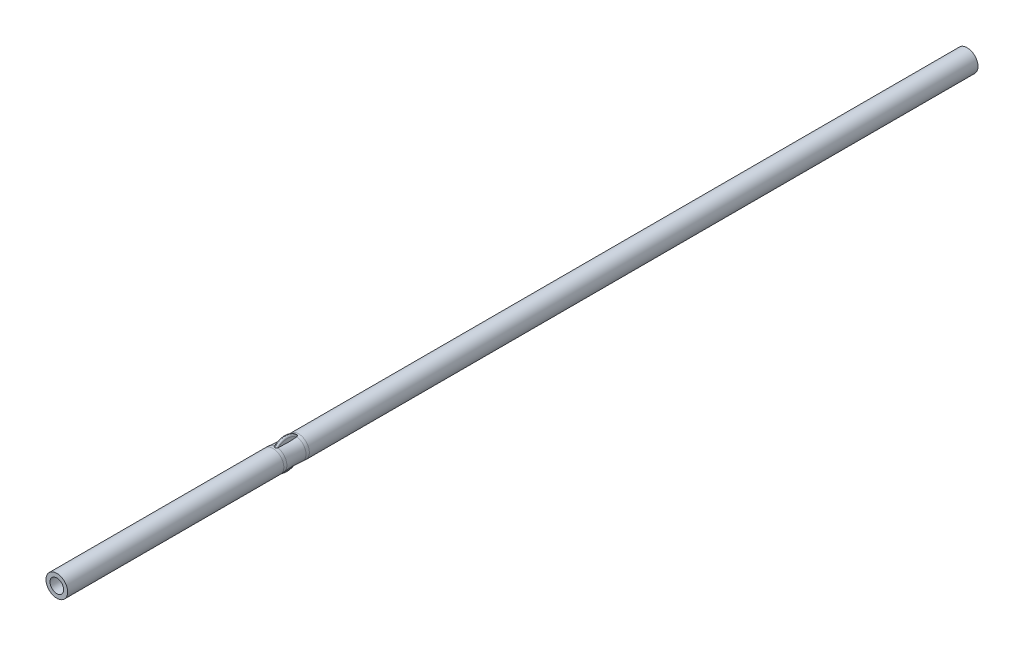
ISO-10303-21;
HEADER;
FILE_DESCRIPTION(('STEP AP214'),'2;1');
FILE_NAME('part.step','',(''),(''),'','','');
FILE_SCHEMA(('AUTOMOTIVE_DESIGN { 1 0 10303 214 1 1 1 1 }'));
ENDSEC;
DATA;
#1=APPLICATION_CONTEXT('core data for automotive mechanical design processes');
#2=APPLICATION_PROTOCOL_DEFINITION('international standard','automotive_design',2000,#1);
#3=PRODUCT_CONTEXT('',#1,'mechanical');
#4=PRODUCT('Part','Part','',(#3));
#5=PRODUCT_RELATED_PRODUCT_CATEGORY('part','',(#4));
#6=PRODUCT_DEFINITION_FORMATION('','',#4);
#7=PRODUCT_DEFINITION_CONTEXT('part definition',#1,'design');
#8=PRODUCT_DEFINITION('design','',#6,#7);
#9=PRODUCT_DEFINITION_SHAPE('','',#8);
#10=(LENGTH_UNIT() NAMED_UNIT(*) SI_UNIT(.MILLI.,.METRE.));
#11=(NAMED_UNIT(*) PLANE_ANGLE_UNIT() SI_UNIT($,.RADIAN.));
#12=(NAMED_UNIT(*) SI_UNIT($,.STERADIAN.) SOLID_ANGLE_UNIT());
#13=UNCERTAINTY_MEASURE_WITH_UNIT(LENGTH_MEASURE(1.E-05),#10,'distance_accuracy_value','');
#14=(GEOMETRIC_REPRESENTATION_CONTEXT(3) GLOBAL_UNCERTAINTY_ASSIGNED_CONTEXT((#13)) GLOBAL_UNIT_ASSIGNED_CONTEXT((#10,
#11,#12)) REPRESENTATION_CONTEXT('',''));
#15=CARTESIAN_POINT('',(0.,0.,0.));
#16=DIRECTION('',(0.,0.,1.));
#17=DIRECTION('',(1.,0.,0.));
#18=AXIS2_PLACEMENT_3D('',#15,#16,#17);
#19=CARTESIAN_POINT('',(0.,0.,88.1));
#20=DIRECTION('',(0.,0.,-1.));
#21=DIRECTION('',(0.,1.,0.));
#22=AXIS2_PLACEMENT_3D('',#19,#20,#21);
#23=TOROIDAL_SURFACE('',#22,14.1117299244164,12.7917298198338);
#24=CARTESIAN_POINT('',(-0.2,-1.86096148301283,91.8161101735564));
#25=CARTESIAN_POINT('',(-0.2,-1.71721299759352,91.345495084414));
#26=CARTESIAN_POINT('',(-0.2,-1.60074055498554,90.8668567384723));
#27=CARTESIAN_POINT('',(-0.2,-1.46873192937673,90.1453794629247));
#28=CARTESIAN_POINT('',(-0.2,-1.43198200923765,89.90633901098));
#29=CARTESIAN_POINT('',(-0.2,-1.37217522383445,89.4265079797272));
#30=CARTESIAN_POINT('',(-0.2,-1.34912086366228,89.1857170883898));
#31=CARTESIAN_POINT('',(-0.2,-1.30765862521222,88.5658250305756));
#32=CARTESIAN_POINT('',(-0.2,-1.29936259928845,88.1860011641327));
#33=CARTESIAN_POINT('',(-0.2,-1.31697148968451,87.4270295550596));
#34=CARTESIAN_POINT('',(-0.2,-1.34289088068266,87.0478821665719));
#35=CARTESIAN_POINT('',(-0.2,-1.42976228485181,86.2832791585611));
#36=CARTESIAN_POINT('',(-0.2,-1.49163777428099,85.8979281414234));
#37=CARTESIAN_POINT('',(-0.2,-1.65031187969031,85.1346041907174));
#38=CARTESIAN_POINT('',(-0.2,-1.74709995424929,84.7566290663631));
#39=CARTESIAN_POINT('',(-0.2,-1.86096148301283,84.3838898264436));
#40=B_SPLINE_CURVE_WITH_KNOTS('',3,(#24,#25,#26,#27,#28,#29,#30,#31,#32,#33,#34,#35,#36,#37,#38,
#39),.UNSPECIFIED.,.F.,.F.,(4,2,2,2,2,2,2,4),(0.,1.47472327029097,2.19990314167509,
2.92521561686359,4.06332251254099,5.20191103355562,6.37112265251417,7.53998153765795),.UNSPECIFIED.);
#41=CARTESIAN_POINT('',(-0.2,-1.3598507853395,89.2793243157044));
#42=VERTEX_POINT('',#41);
#43=CARTESIAN_POINT('',(-0.2,-1.3598507853395,86.9206756842956));
#44=VERTEX_POINT('',#43);
#45=EDGE_CURVE('E140',#42,#44,#40,.T.);
#46=ORIENTED_EDGE('',*,*,#45,.F.);
#47=CARTESIAN_POINT('',(-0.2,-1.3598507853395,89.2793243157044));
#48=CARTESIAN_POINT('',(-0.200019596128469,-1.36076425183599,89.2891000206907));
#49=CARTESIAN_POINT('',(-0.199634503240254,-1.36174308129407,89.2988357212865));
#50=CARTESIAN_POINT('',(-0.198054912933544,-1.36383150116574,89.3182274389844));
#51=CARTESIAN_POINT('',(-0.196860388360237,-1.36494109596521,89.3278834534022));
#52=CARTESIAN_POINT('',(-0.195261147615435,-1.36611605811216,89.3374994607451));
#53=B_SPLINE_CURVE_WITH_KNOTS('',3,(#47,#48,#49,#50,#51,#52),.UNSPECIFIED.,.F.,.F.,(4,2,4),(0.,
0.0293770731623685,0.0587551319154903),.UNSPECIFIED.);
#54=CARTESIAN_POINT('',(-0.195261147615435,-1.36611605811216,89.3374994607451));
#55=VERTEX_POINT('',#54);
#56=EDGE_CURVE('E186',#42,#55,#53,.T.);
#57=ORIENTED_EDGE('',*,*,#56,.T.);
#58=CARTESIAN_POINT('',(0.,0.,89.3374994607451));
#59=DIRECTION('',(0.,0.,-1.));
#60=DIRECTION('',(0.,1.,0.));
#61=AXIS2_PLACEMENT_3D('',#58,#59,#60);
#62=CIRCLE('',#61,1.38);
#63=CARTESIAN_POINT('',(-0.195261147615435,1.36611605811216,89.3374994607451));
#64=VERTEX_POINT('',#63);
#65=EDGE_CURVE('E321',#55,#64,#62,.T.);
#66=ORIENTED_EDGE('',*,*,#65,.T.);
#67=CARTESIAN_POINT('',(-0.195261147615435,1.36611605811216,89.3374994607451));
#68=CARTESIAN_POINT('',(-0.196860388360237,1.36494109596521,89.3278834534022));
#69=CARTESIAN_POINT('',(-0.198054912933543,1.36383150116574,89.3182274389844));
#70=CARTESIAN_POINT('',(-0.199634503240253,1.36174308129407,89.2988357212865));
#71=CARTESIAN_POINT('',(-0.200019596128469,1.36076425183598,89.2891000206907));
#72=CARTESIAN_POINT('',(-0.2,1.3598507853395,89.2793243157044));
#73=B_SPLINE_CURVE_WITH_KNOTS('',3,(#67,#68,#69,#70,#71,#72),.UNSPECIFIED.,.F.,.F.,(4,2,4),(0.,
0.0293780587531077,0.0587551319154771),.UNSPECIFIED.);
#74=CARTESIAN_POINT('',(-0.2,1.3598507853395,89.2793243157044));
#75=VERTEX_POINT('',#74);
#76=EDGE_CURVE('E135',#64,#75,#73,.T.);
#77=ORIENTED_EDGE('',*,*,#76,.T.);
#78=CARTESIAN_POINT('',(-0.2,1.86096148301283,91.8161101735564));
#79=CARTESIAN_POINT('',(-0.2,1.71721299759352,91.345495084414));
#80=CARTESIAN_POINT('',(-0.2,1.60074055498554,90.8668567384723));
#81=CARTESIAN_POINT('',(-0.2,1.46873192937673,90.1453794629247));
#82=CARTESIAN_POINT('',(-0.2,1.43198200923765,89.90633901098));
#83=CARTESIAN_POINT('',(-0.2,1.37217522383445,89.4265079797272));
#84=CARTESIAN_POINT('',(-0.2,1.34912086366228,89.1857170883898));
#85=CARTESIAN_POINT('',(-0.2,1.30765862521223,88.5658250305757));
#86=CARTESIAN_POINT('',(-0.2,1.29936259928845,88.1860011641328));
#87=CARTESIAN_POINT('',(-0.2,1.31697148968451,87.4270295550596));
#88=CARTESIAN_POINT('',(-0.2,1.34289088068266,87.0478821665719));
#89=CARTESIAN_POINT('',(-0.2,1.42976228485181,86.2832791585611));
#90=CARTESIAN_POINT('',(-0.2,1.491637774281,85.8979281414234));
#91=CARTESIAN_POINT('',(-0.2,1.65031187969032,85.1346041907174));
#92=CARTESIAN_POINT('',(-0.2,1.74709995424929,84.756629066363));
#93=CARTESIAN_POINT('',(-0.2,1.86096148301283,84.3838898264436));
#94=B_SPLINE_CURVE_WITH_KNOTS('',3,(#78,#79,#80,#81,#82,#83,#84,#85,#86,#87,#88,#89,#90,#91,#92,
#93),.UNSPECIFIED.,.F.,.F.,(4,2,2,2,2,2,2,4),(0.,1.47472327029097,2.19990314167511,
2.92521561686357,4.06332251254096,5.20191103355562,6.37112265251418,7.53998153765795),.UNSPECIFIED.);
#95=CARTESIAN_POINT('',(-0.2,1.3598507853395,86.9206756842956));
#96=VERTEX_POINT('',#95);
#97=EDGE_CURVE('E207',#75,#96,#94,.T.);
#98=ORIENTED_EDGE('',*,*,#97,.T.);
#99=CARTESIAN_POINT('',(-0.2,1.3598507853395,86.9206756842956));
#100=CARTESIAN_POINT('',(-0.200019596128469,1.36076425183598,86.9108999793093));
#101=CARTESIAN_POINT('',(-0.199634503240254,1.36174308129407,86.9011642787135));
#102=CARTESIAN_POINT('',(-0.198054912933545,1.36383150116574,86.8817725610156));
#103=CARTESIAN_POINT('',(-0.19686038836024,1.36494109596521,86.8721165465979));
#104=CARTESIAN_POINT('',(-0.19526114761544,1.36611605811215,86.8625005392549));
#105=B_SPLINE_CURVE_WITH_KNOTS('',3,(#99,#100,#101,#102,#103,#104),.UNSPECIFIED.,.F.,.F.,(4,2,
4),(0.,0.0293770731623556,0.0587551319154488),.UNSPECIFIED.);
#106=CARTESIAN_POINT('',(-0.195261147615438,1.36611605811216,86.8625005392549));
#107=VERTEX_POINT('',#106);
#108=EDGE_CURVE('E257',#96,#107,#105,.T.);
#109=ORIENTED_EDGE('',*,*,#108,.T.);
#110=CARTESIAN_POINT('',(0.,0.,86.8625005392549));
#111=DIRECTION('',(0.,0.,-1.));
#112=DIRECTION('',(0.,1.,0.));
#113=AXIS2_PLACEMENT_3D('',#110,#111,#112);
#114=CIRCLE('',#113,1.38);
#115=CARTESIAN_POINT('',(-0.195261147615437,-1.36611605811216,86.8625005392549));
#116=VERTEX_POINT('',#115);
#117=EDGE_CURVE('E320',#116,#107,#114,.T.);
#118=ORIENTED_EDGE('',*,*,#117,.F.);
#119=CARTESIAN_POINT('',(-0.195261147615437,-1.36611605811216,86.8625005392549));
#120=CARTESIAN_POINT('',(-0.196860388360238,-1.36494109596521,86.8721165465979));
#121=CARTESIAN_POINT('',(-0.198054912933545,-1.36383150116574,86.8817725610156));
#122=CARTESIAN_POINT('',(-0.199634503240254,-1.36174308129407,86.9011642787135));
#123=CARTESIAN_POINT('',(-0.200019596128469,-1.36076425183598,86.9108999793093));
#124=CARTESIAN_POINT('',(-0.2,-1.3598507853395,86.9206756842956));
#125=B_SPLINE_CURVE_WITH_KNOTS('',3,(#119,#120,#121,#122,#123,#124),.UNSPECIFIED.,.F.,.F.,(4,2,
4),(0.,0.0293780587531078,0.0587551319154632),.UNSPECIFIED.);
#126=EDGE_CURVE('E167',#116,#44,#125,.T.);
#127=ORIENTED_EDGE('',*,*,#126,.T.);
#128=EDGE_LOOP('',(#46,#57,#66,#77,#98,#109,#118,#127));
#129=FACE_BOUND('',#128,.T.);
#130=ADVANCED_FACE('F36',(#129),#23,.F.);
#131=CARTESIAN_POINT('',(0.,0.,89.75));
#132=DIRECTION('',(0.,0.,-1.));
#133=DIRECTION('',(0.,1.,0.));
#134=AXIS2_PLACEMENT_3D('',#131,#132,#133);
#135=DEGENERATE_TOROIDAL_SURFACE('',#134,2.86391737213984,4.26391737213984,.F.);
#136=CARTESIAN_POINT('',(0.,0.,89.75));
#137=DIRECTION('',(0.,0.,1.));
#138=DIRECTION('',(1.,0.,0.));
#139=AXIS2_PLACEMENT_3D('',#136,#137,#138);
#140=CIRCLE('',#139,1.4);
#141=CARTESIAN_POINT('',(1.4,0.,89.75));
#142=VERTEX_POINT('',#141);
#143=EDGE_CURVE('E310',#142,#142,#140,.T.);
#144=ORIENTED_EDGE('',*,*,#143,.F.);
#145=EDGE_LOOP('',(#144));
#146=FACE_BOUND('',#145,.T.);
#147=CARTESIAN_POINT('',(-0.195261147615435,-1.36611605811216,89.3374994607451));
#148=CARTESIAN_POINT('',(-0.192478844289928,-1.36812992832893,89.3540146496726));
#149=CARTESIAN_POINT('',(-0.188392121271777,-1.37021847742794,89.3703949060523));
#150=CARTESIAN_POINT('',(-0.177373844867738,-1.37444646222969,89.4023061997266));
#151=CARTESIAN_POINT('',(-0.170418625298114,-1.37658617834086,89.4178289243041));
#152=CARTESIAN_POINT('',(-0.155924210242822,-1.38017236038315,89.4428950275455));
#153=CARTESIAN_POINT('',(-0.149138603684464,-1.3816400015143,89.4528674122174));
#154=CARTESIAN_POINT('',(-0.134040759894056,-1.38445731708408,89.4715693822342));
#155=CARTESIAN_POINT('',(-0.125732884817513,-1.38580731273446,89.4803023953156));
#156=CARTESIAN_POINT('',(-0.107568776834771,-1.38831907598677,89.4962399949377));
#157=CARTESIAN_POINT('',(-0.097697636753142,-1.38947878660767,89.503428109826));
#158=CARTESIAN_POINT('',(-0.0767042607046543,-1.3914908467928,89.515726313652));
#159=CARTESIAN_POINT('',(-0.0655835746668996,-1.39234357173667,89.5208389414624));
#160=CARTESIAN_POINT('',(-0.0453758278733917,-1.39348805243894,89.5276514173359));
#161=CARTESIAN_POINT('',(-0.0364710117537916,-1.39386658555878,89.5298838423034));
#162=CARTESIAN_POINT('',(-0.0183821990418215,-1.39437813307213,89.5328900208689));
#163=CARTESIAN_POINT('',(-0.00919736719541687,-1.39451032080467,89.5336588633092));
#164=CARTESIAN_POINT('',(0.,-1.39450762481857,89.5336486613961));
#165=B_SPLINE_CURVE_WITH_KNOTS('',3,(#147,#148,#149,#150,#151,#152,#153,#154,#155,#156,#157,
#158,#159,#160,#161,#162,#163,#164),.UNSPECIFIED.,.F.,.F.,(4,2,2,2,2,2,2,2,4),(0.,
0.0507058068165734,0.101838601204314,0.138150616177536,0.174360159449208,0.210938469663902,
0.247471899061619,0.27491764728978,0.302455330491517),.UNSPECIFIED.);
#166=CARTESIAN_POINT('',(0.,-1.39450762481857,89.5336486613961));
#167=VERTEX_POINT('',#166);
#168=EDGE_CURVE('E192',#55,#167,#165,.T.);
#169=ORIENTED_EDGE('',*,*,#168,.T.);
#170=CARTESIAN_POINT('',(0.,-1.39450762481857,89.5336486613961));
#171=CARTESIAN_POINT('',(0.00975802499848896,-1.3945113706491,89.5336636199569));
#172=CARTESIAN_POINT('',(0.0195042979014323,-1.39436198098152,89.5327954167007));
#173=CARTESIAN_POINT('',(0.038653283027193,-1.39378675850753,89.5294137188238));
#174=CARTESIAN_POINT('',(0.0480573944106574,-1.3933622279758,89.5269079744178));
#175=CARTESIAN_POINT('',(0.0662904694920863,-1.39226655084536,89.5203732154153));
#176=CARTESIAN_POINT('',(0.0751199535415663,-1.391595631127,89.5163456020896));
#177=CARTESIAN_POINT('',(0.0920200696412726,-1.39005338891652,89.5069537152467));
#178=CARTESIAN_POINT('',(0.100090091540164,-1.38918190719719,89.5015883794211));
#179=CARTESIAN_POINT('',(0.115735346480138,-1.38723862188494,89.4894172375514));
#180=CARTESIAN_POINT('',(0.12326160278587,-1.38615864249651,89.4825501034704));
#181=CARTESIAN_POINT('',(0.137237579664178,-1.38388855204391,89.4678153159534));
#182=CARTESIAN_POINT('',(0.143686623616673,-1.38269837248465,89.4599470391031));
#183=CARTESIAN_POINT('',(0.157967194242545,-1.37974205359234,89.4399584596115));
#184=CARTESIAN_POINT('',(0.165239472477391,-1.37794419845648,89.4274416034963));
#185=CARTESIAN_POINT('',(0.177625913865752,-1.37432924070213,89.4013912770424));
#186=CARTESIAN_POINT('',(0.182737003205642,-1.37251211441231,89.3878563907703));
#187=CARTESIAN_POINT('',(0.19038784016784,-1.36916045504794,89.3620300554119));
#188=CARTESIAN_POINT('',(0.193179921324363,-1.36762060637055,89.3498141256472));
#189=CARTESIAN_POINT('',(0.195261147618885,-1.36611605811186,89.3374994607462));
#190=B_SPLINE_CURVE_WITH_KNOTS('',3,(#170,#171,#172,#173,#174,#175,#176,#177,#178,#179,#180,
#181,#182,#183,#184,#185,#186,#187,#188,#189),.UNSPECIFIED.,.F.,.F.,(4,2,2,2,2,2,2,2,2,4),(0.,
0.0292159009899558,0.0582945196412137,0.0873464289519926,0.116421482776291,0.147039327655849,
0.177676332521398,0.221198175360278,0.264781711874905,0.302541406578888),.UNSPECIFIED.);
#191=CARTESIAN_POINT('',(0.195261147615435,-1.36611605811216,89.3374994607451));
#192=VERTEX_POINT('',#191);
#193=EDGE_CURVE('E50',#167,#192,#190,.T.);
#194=ORIENTED_EDGE('',*,*,#193,.T.);
#195=CARTESIAN_POINT('',(0.195261147615436,1.36611605811216,89.3374994607451));
#196=VERTEX_POINT('',#195);
#197=EDGE_CURVE('E56',#196,#192,#62,.T.);
#198=ORIENTED_EDGE('',*,*,#197,.F.);
#199=CARTESIAN_POINT('',(0.195261147615436,1.36611605811216,89.3374994607451));
#200=CARTESIAN_POINT('',(0.192478844289927,1.36812992832893,89.3540146496727));
#201=CARTESIAN_POINT('',(0.188392121271773,1.37021847742794,89.3703949060523));
#202=CARTESIAN_POINT('',(0.17737384486773,1.37444646222969,89.4023061997266));
#203=CARTESIAN_POINT('',(0.17041862529811,1.37658617834086,89.4178289243041));
#204=CARTESIAN_POINT('',(0.155924210242823,1.38017236038314,89.4428950275455));
#205=CARTESIAN_POINT('',(0.149138603684465,1.3816400015143,89.4528674122174));
#206=CARTESIAN_POINT('',(0.134040759894056,1.38445731708408,89.4715693822342));
#207=CARTESIAN_POINT('',(0.125732884817513,1.38580731273446,89.4803023953156));
#208=CARTESIAN_POINT('',(0.107568776834769,1.38831907598677,89.4962399949377));
#209=CARTESIAN_POINT('',(0.0976976367531379,1.38947878660767,89.503428109826));
#210=CARTESIAN_POINT('',(0.0767042607046495,1.3914908467928,89.515726313652));
#211=CARTESIAN_POINT('',(0.0655835746668975,1.39234357173667,89.5208389414624));
#212=CARTESIAN_POINT('',(0.0453758278734126,1.39348805243894,89.5276514173359));
#213=CARTESIAN_POINT('',(0.0364710117538332,1.39386658555878,89.5298838423034));
#214=CARTESIAN_POINT('',(0.018382199041906,1.39437813307212,89.5328900208689));
#215=CARTESIAN_POINT('',(0.00919736719552361,1.39451032080467,89.5336588633092));
#216=CARTESIAN_POINT('',(1.27508180640819E-13,1.39450762481857,89.5336486613961));
#217=B_SPLINE_CURVE_WITH_KNOTS('',3,(#199,#200,#201,#202,#203,#204,#205,#206,#207,#208,#209,
#210,#211,#212,#213,#214,#215,#216),.UNSPECIFIED.,.F.,.F.,(4,2,2,2,2,2,2,2,4),(0.,
0.0507058068166028,0.101838601204314,0.138150616177536,0.174360159449208,0.210938469663918,
0.24747189906162,0.274917647289718,0.30245533049139),.UNSPECIFIED.);
#218=CARTESIAN_POINT('',(1.252795610307E-13,1.39450762481857,89.5336486613961));
#219=VERTEX_POINT('',#218);
#220=EDGE_CURVE('E118',#196,#219,#217,.T.);
#221=ORIENTED_EDGE('',*,*,#220,.T.);
#222=CARTESIAN_POINT('',(1.252795610307E-13,1.39450762481857,89.5336486613961));
#223=CARTESIAN_POINT('',(-0.0097580249983637,1.3945113706491,89.5336636199569));
#224=CARTESIAN_POINT('',(-0.0195042979013059,1.39436198098152,89.5327954167007));
#225=CARTESIAN_POINT('',(-0.0386532830270649,1.39378675850753,89.5294137188238));
#226=CARTESIAN_POINT('',(-0.0480573944105287,1.3933622279758,89.5269079744178));
#227=CARTESIAN_POINT('',(-0.066290469491958,1.39226655084536,89.5203732154154));
#228=CARTESIAN_POINT('',(-0.0751199535414392,1.39159563112701,89.5163456020897));
#229=CARTESIAN_POINT('',(-0.0920200696411522,1.39005338891653,89.5069537152468));
#230=CARTESIAN_POINT('',(-0.100090091540049,1.38918190719721,89.5015883794212));
#231=CARTESIAN_POINT('',(-0.11573534648003,1.38723862188495,89.4894172375515));
#232=CARTESIAN_POINT('',(-0.123261602785765,1.38615864249652,89.4825501034705));
#233=CARTESIAN_POINT('',(-0.137237579664081,1.38388855204393,89.4678153159535));
#234=CARTESIAN_POINT('',(-0.14368662361658,1.38269837248466,89.4599470391032));
#235=CARTESIAN_POINT('',(-0.157967194242461,1.37974205359236,89.4399584596116));
#236=CARTESIAN_POINT('',(-0.165239472477313,1.3779441984565,89.4274416034964));
#237=CARTESIAN_POINT('',(-0.177625913865689,1.37432924070216,89.4013912770425));
#238=CARTESIAN_POINT('',(-0.182737003205585,1.37251211441233,89.3878563907705));
#239=CARTESIAN_POINT('',(-0.190387840167815,1.36916045504795,89.3620300554121));
#240=CARTESIAN_POINT('',(-0.193179921324355,1.36762060637056,89.3498141256473));
#241=CARTESIAN_POINT('',(-0.195261147618888,1.36611605811185,89.3374994607461));
#242=B_SPLINE_CURVE_WITH_KNOTS('',3,(#222,#223,#224,#225,#226,#227,#228,#229,#230,#231,#232,
#233,#234,#235,#236,#237,#238,#239,#240,#241),.UNSPECIFIED.,.F.,.F.,(4,2,2,2,2,2,2,2,2,4),(0.,
0.0292159009899517,0.0582945196412057,0.0873464289519738,0.116421482776279,0.147039327655823,
0.177676332521369,0.221198175360234,0.264781711874856,0.302541406579028),.UNSPECIFIED.);
#243=EDGE_CURVE('E121',#219,#64,#242,.T.);
#244=ORIENTED_EDGE('',*,*,#243,.T.);
#245=ORIENTED_EDGE('',*,*,#65,.F.);
#246=EDGE_LOOP('',(#169,#194,#198,#221,#244,#245));
#247=FACE_BOUND('',#246,.T.);
#248=ADVANCED_FACE('F120',(#146,#247),#135,.F.);
#249=ORIENTED_EDGE('',*,*,#197,.T.);
#250=CARTESIAN_POINT('',(0.195261147615435,-1.36611605811216,89.3374994607451));
#251=CARTESIAN_POINT('',(0.196860388360237,-1.36494109596521,89.3278834534022));
#252=CARTESIAN_POINT('',(0.198054912933543,-1.36383150116574,89.3182274389844));
#253=CARTESIAN_POINT('',(0.199634503240253,-1.36174308129407,89.2988357212865));
#254=CARTESIAN_POINT('',(0.200019596128469,-1.36076425183598,89.2891000206907));
#255=CARTESIAN_POINT('',(0.2,-1.3598507853395,89.2793243157044));
#256=B_SPLINE_CURVE_WITH_KNOTS('',3,(#250,#251,#252,#253,#254,#255),.UNSPECIFIED.,.F.,.F.,(4,2,
4),(0.,0.0293780587531078,0.0587551319154773),.UNSPECIFIED.);
#257=CARTESIAN_POINT('',(0.2,-1.3598507853395,89.2793243157044));
#258=VERTEX_POINT('',#257);
#259=EDGE_CURVE('E11',#192,#258,#256,.T.);
#260=ORIENTED_EDGE('',*,*,#259,.T.);
#261=CARTESIAN_POINT('',(0.2,-1.86096148301283,91.8161101735564));
#262=CARTESIAN_POINT('',(0.2,-1.71721299759352,91.345495084414));
#263=CARTESIAN_POINT('',(0.2,-1.60074055498554,90.8668567384723));
#264=CARTESIAN_POINT('',(0.2,-1.46873192937673,90.1453794629247));
#265=CARTESIAN_POINT('',(0.2,-1.43198200923765,89.90633901098));
#266=CARTESIAN_POINT('',(0.2,-1.37217522383445,89.4265079797272));
#267=CARTESIAN_POINT('',(0.2,-1.34912086366228,89.1857170883898));
#268=CARTESIAN_POINT('',(0.2,-1.30765862521222,88.5658250305757));
#269=CARTESIAN_POINT('',(0.2,-1.29936259928845,88.1860011641328));
#270=CARTESIAN_POINT('',(0.2,-1.31697148968451,87.4270295550596));
#271=CARTESIAN_POINT('',(0.2,-1.34289088068265,87.0478821665719));
#272=CARTESIAN_POINT('',(0.2,-1.42976228485181,86.2832791585611));
#273=CARTESIAN_POINT('',(0.2,-1.49163777428099,85.8979281414234));
#274=CARTESIAN_POINT('',(0.2,-1.65031187969032,85.1346041907174));
#275=CARTESIAN_POINT('',(0.2,-1.74709995424929,84.7566290663631));
#276=CARTESIAN_POINT('',(0.2,-1.86096148301283,84.3838898264436));
#277=B_SPLINE_CURVE_WITH_KNOTS('',3,(#261,#262,#263,#264,#265,#266,#267,#268,#269,#270,#271,
#272,#273,#274,#275,#276),.UNSPECIFIED.,.F.,.F.,(4,2,2,2,2,2,2,4),(0.,1.47472327029097,
2.19990314167511,2.92521561686357,4.06332251254096,5.2019110335556,6.37112265251417,
7.53998153765795),.UNSPECIFIED.);
#278=CARTESIAN_POINT('',(0.2,-1.3598507853395,86.9206756842956));
#279=VERTEX_POINT('',#278);
#280=EDGE_CURVE('E143',#258,#279,#277,.T.);
#281=ORIENTED_EDGE('',*,*,#280,.T.);
#282=CARTESIAN_POINT('',(0.2,-1.3598507853395,86.9206756842956));
#283=CARTESIAN_POINT('',(0.200019596128469,-1.36076425183598,86.9108999793093));
#284=CARTESIAN_POINT('',(0.199634503240254,-1.36174308129407,86.9011642787135));
#285=CARTESIAN_POINT('',(0.198054912933545,-1.36383150116574,86.8817725610156));
#286=CARTESIAN_POINT('',(0.19686038836024,-1.36494109596521,86.8721165465979));
#287=CARTESIAN_POINT('',(0.19526114761544,-1.36611605811215,86.8625005392549));
#288=B_SPLINE_CURVE_WITH_KNOTS('',3,(#282,#283,#284,#285,#286,#287),.UNSPECIFIED.,.F.,.F.,(4,2,
4),(0.,0.0293770731623556,0.0587551319154488),.UNSPECIFIED.);
#289=CARTESIAN_POINT('',(0.195261147615437,-1.36611605811216,86.8625005392549));
#290=VERTEX_POINT('',#289);
#291=EDGE_CURVE('E264',#279,#290,#288,.T.);
#292=ORIENTED_EDGE('',*,*,#291,.T.);
#293=CARTESIAN_POINT('',(0.195261147615438,1.36611605811216,86.8625005392549));
#294=VERTEX_POINT('',#293);
#295=EDGE_CURVE('E64',#294,#290,#114,.T.);
#296=ORIENTED_EDGE('',*,*,#295,.F.);
#297=CARTESIAN_POINT('',(0.195261147615438,1.36611605811216,86.8625005392549));
#298=CARTESIAN_POINT('',(0.196860388360239,1.36494109596521,86.8721165465979));
#299=CARTESIAN_POINT('',(0.198054912933544,1.36383150116574,86.8817725610156));
#300=CARTESIAN_POINT('',(0.199634503240254,1.36174308129407,86.9011642787135));
#301=CARTESIAN_POINT('',(0.200019596128469,1.36076425183598,86.9108999793093));
#302=CARTESIAN_POINT('',(0.2,1.3598507853395,86.9206756842956));
#303=B_SPLINE_CURVE_WITH_KNOTS('',3,(#297,#298,#299,#300,#301,#302),.UNSPECIFIED.,.F.,.F.,(4,2,
4),(0.,0.0293780587531074,0.0587551319154629),.UNSPECIFIED.);
#304=CARTESIAN_POINT('',(0.2,1.35985078533949,86.9206756842956));
#305=VERTEX_POINT('',#304);
#306=EDGE_CURVE('E136',#294,#305,#303,.T.);
#307=ORIENTED_EDGE('',*,*,#306,.T.);
#308=CARTESIAN_POINT('',(0.2,1.86096148301283,91.8161101735564));
#309=CARTESIAN_POINT('',(0.2,1.71721299759352,91.345495084414));
#310=CARTESIAN_POINT('',(0.2,1.60074055498554,90.8668567384723));
#311=CARTESIAN_POINT('',(0.2,1.46873192937673,90.1453794629247));
#312=CARTESIAN_POINT('',(0.2,1.43198200923765,89.90633901098));
#313=CARTESIAN_POINT('',(0.2,1.37217522383445,89.4265079797272));
#314=CARTESIAN_POINT('',(0.2,1.34912086366228,89.1857170883898));
#315=CARTESIAN_POINT('',(0.2,1.30765862521223,88.5658250305756));
#316=CARTESIAN_POINT('',(0.2,1.29936259928845,88.1860011641327));
#317=CARTESIAN_POINT('',(0.2,1.31697148968451,87.4270295550596));
#318=CARTESIAN_POINT('',(0.2,1.34289088068266,87.0478821665719));
#319=CARTESIAN_POINT('',(0.2,1.42976228485181,86.2832791585611));
#320=CARTESIAN_POINT('',(0.2,1.49163777428099,85.8979281414234));
#321=CARTESIAN_POINT('',(0.2,1.65031187969032,85.1346041907174));
#322=CARTESIAN_POINT('',(0.2,1.74709995424929,84.7566290663631));
#323=CARTESIAN_POINT('',(0.2,1.86096148301283,84.3838898264436));
#324=B_SPLINE_CURVE_WITH_KNOTS('',3,(#308,#309,#310,#311,#312,#313,#314,#315,#316,#317,#318,
#319,#320,#321,#322,#323),.UNSPECIFIED.,.F.,.F.,(4,2,2,2,2,2,2,4),(0.,1.47472327029097,
2.19990314167511,2.92521561686357,4.06332251254099,5.20191103355562,6.37112265251417,
7.53998153765795),.UNSPECIFIED.);
#325=CARTESIAN_POINT('',(0.2,1.3598507853395,89.2793243157044));
#326=VERTEX_POINT('',#325);
#327=EDGE_CURVE('E217',#326,#305,#324,.T.);
#328=ORIENTED_EDGE('',*,*,#327,.F.);
#329=CARTESIAN_POINT('',(0.2,1.3598507853395,89.2793243157044));
#330=CARTESIAN_POINT('',(0.200019596128469,1.36076425183598,89.2891000206907));
#331=CARTESIAN_POINT('',(0.199634503240254,1.36174308129407,89.2988357212865));
#332=CARTESIAN_POINT('',(0.198054912933544,1.36383150116574,89.3182274389844));
#333=CARTESIAN_POINT('',(0.196860388360238,1.36494109596521,89.3278834534022));
#334=CARTESIAN_POINT('',(0.195261147615437,1.36611605811216,89.3374994607451));
#335=B_SPLINE_CURVE_WITH_KNOTS('',3,(#329,#330,#331,#332,#333,#334),.UNSPECIFIED.,.F.,.F.,(4,2,
4),(0.,0.0293770731623556,0.0587551319154632),.UNSPECIFIED.);
#336=EDGE_CURVE('E126',#326,#196,#335,.T.);
#337=ORIENTED_EDGE('',*,*,#336,.T.);
#338=EDGE_LOOP('',(#249,#260,#281,#292,#296,#307,#328,#337));
#339=FACE_BOUND('',#338,.T.);
#340=ADVANCED_FACE('F199',(#339),#23,.F.);
#341=CARTESIAN_POINT('',(0.,0.,86.45));
#342=DIRECTION('',(0.,0.,-1.));
#343=DIRECTION('',(0.,1.,0.));
#344=AXIS2_PLACEMENT_3D('',#341,#342,#343);
#345=DEGENERATE_TOROIDAL_SURFACE('',#344,2.86391737213984,4.26391737213984,.F.);
#346=CARTESIAN_POINT('',(0.,0.,86.45));
#347=DIRECTION('',(0.,0.,-1.));
#348=DIRECTION('',(0.,1.,0.));
#349=AXIS2_PLACEMENT_3D('',#346,#347,#348);
#350=CIRCLE('',#349,1.4);
#351=CARTESIAN_POINT('',(0.,1.4,86.45));
#352=VERTEX_POINT('',#351);
#353=EDGE_CURVE('E314',#352,#352,#350,.T.);
#354=ORIENTED_EDGE('',*,*,#353,.F.);
#355=EDGE_LOOP('',(#354));
#356=FACE_BOUND('',#355,.T.);
#357=ORIENTED_EDGE('',*,*,#295,.T.);
#358=CARTESIAN_POINT('',(0.195261147615437,-1.36611605811216,86.8625005392549));
#359=CARTESIAN_POINT('',(0.192478844289928,-1.36812992832893,86.8459853503274));
#360=CARTESIAN_POINT('',(0.188392121271778,-1.37021847742794,86.8296050939477));
#361=CARTESIAN_POINT('',(0.177373844867741,-1.37444646222969,86.7976938002734));
#362=CARTESIAN_POINT('',(0.170418625298121,-1.37658617834086,86.7821710756959));
#363=CARTESIAN_POINT('',(0.155924210242828,-1.38017236038314,86.7571049724545));
#364=CARTESIAN_POINT('',(0.149138603684467,-1.3816400015143,86.7471325877826));
#365=CARTESIAN_POINT('',(0.134040759894061,-1.38445731708408,86.7284306177658));
#366=CARTESIAN_POINT('',(0.125732884817523,-1.38580731273445,86.7196976046843));
#367=CARTESIAN_POINT('',(0.107568776834782,-1.38831907598677,86.7037600050623));
#368=CARTESIAN_POINT('',(0.0976976367531488,-1.38947878660766,86.696571890174));
#369=CARTESIAN_POINT('',(0.0767042607046569,-1.3914908467928,86.684273686348));
#370=CARTESIAN_POINT('',(0.0655835746669022,-1.39234357173667,86.6791610585376));
#371=CARTESIAN_POINT('',(0.0453758278733922,-1.39348805243894,86.6723485826641));
#372=CARTESIAN_POINT('',(0.0364710117537902,-1.39386658555878,86.6701161576966));
#373=CARTESIAN_POINT('',(0.0183821990418165,-1.39437813307213,86.6671099791311));
#374=CARTESIAN_POINT('',(0.00919736719541024,-1.39451032080467,86.6663411366908));
#375=CARTESIAN_POINT('',(0.,-1.39450762481857,86.6663513386039));
#376=B_SPLINE_CURVE_WITH_KNOTS('',3,(#358,#359,#360,#361,#362,#363,#364,#365,#366,#367,#368,
#369,#370,#371,#372,#373,#374,#375),.UNSPECIFIED.,.F.,.F.,(4,2,2,2,2,2,2,2,4),(0.,
0.0507058068165871,0.101838601204312,0.138150616177536,0.174360159449214,0.210938469663912,
0.247471899061632,0.274917647289798,0.302455330491539),.UNSPECIFIED.);
#377=CARTESIAN_POINT('',(0.,-1.39450762481857,86.6663513386039));
#378=VERTEX_POINT('',#377);
#379=EDGE_CURVE('E270',#290,#378,#376,.T.);
#380=ORIENTED_EDGE('',*,*,#379,.T.);
#381=CARTESIAN_POINT('',(0.,-1.39450762481857,86.6663513386039));
#382=CARTESIAN_POINT('',(-0.00975802499850324,-1.3945113706491,86.6663363800431));
#383=CARTESIAN_POINT('',(-0.0195042979014457,-1.39436198098152,86.6672045832994));
#384=CARTESIAN_POINT('',(-0.0386532830272034,-1.39378675850753,86.6705862811762));
#385=CARTESIAN_POINT('',(-0.0480573944106657,-1.3933622279758,86.6730920255822));
#386=CARTESIAN_POINT('',(-0.0662904694920944,-1.39226655084535,86.6796267845847));
#387=CARTESIAN_POINT('',(-0.0751199535415765,-1.391595631127,86.6836543979104));
#388=CARTESIAN_POINT('',(-0.092020069641283,-1.39005338891652,86.6930462847533));
#389=CARTESIAN_POINT('',(-0.100090091540172,-1.38918190719719,86.6984116205789));
#390=CARTESIAN_POINT('',(-0.115735346480149,-1.38723862188494,86.7105827624486));
#391=CARTESIAN_POINT('',(-0.123261602785888,-1.3861586424965,86.7174498965296));
#392=CARTESIAN_POINT('',(-0.137237579664196,-1.38388855204391,86.7321846840466));
#393=CARTESIAN_POINT('',(-0.143686623616687,-1.38269837248464,86.7400529608969));
#394=CARTESIAN_POINT('',(-0.157967194242555,-1.37974205359234,86.7600415403885));
#395=CARTESIAN_POINT('',(-0.165239472477404,-1.37794419845648,86.7725583965037));
#396=CARTESIAN_POINT('',(-0.177625913865767,-1.37432924070213,86.7986087229576));
#397=CARTESIAN_POINT('',(-0.182737003205653,-1.3725121144123,86.8121436092297));
#398=CARTESIAN_POINT('',(-0.190387840167844,-1.36916045504794,86.8379699445881));
#399=CARTESIAN_POINT('',(-0.193179921324364,-1.36762060637055,86.8501858743528));
#400=CARTESIAN_POINT('',(-0.195261147618888,-1.36611605811185,86.8625005392538));
#401=B_SPLINE_CURVE_WITH_KNOTS('',3,(#381,#382,#383,#384,#385,#386,#387,#388,#389,#390,#391,
#392,#393,#394,#395,#396,#397,#398,#399,#400),.UNSPECIFIED.,.F.,.F.,(4,2,2,2,2,2,2,2,2,4),(0.,
0.0292159009899571,0.0582945196412163,0.087346428951988,0.116421482776296,0.147039327655861,
0.177676332521405,0.221198175360286,0.264781711874924,0.302541406578893),.UNSPECIFIED.);
#402=EDGE_CURVE('E160',#378,#116,#401,.T.);
#403=ORIENTED_EDGE('',*,*,#402,.T.);
#404=ORIENTED_EDGE('',*,*,#117,.T.);
#405=CARTESIAN_POINT('',(-0.195261147615438,1.36611605811216,86.8625005392549));
#406=CARTESIAN_POINT('',(-0.192478844289928,1.36812992832893,86.8459853503274));
#407=CARTESIAN_POINT('',(-0.188392121271778,1.37021847742794,86.8296050939477));
#408=CARTESIAN_POINT('',(-0.177373844867741,1.37444646222969,86.7976938002734));
#409=CARTESIAN_POINT('',(-0.170418625298122,1.37658617834086,86.7821710756959));
#410=CARTESIAN_POINT('',(-0.155924210242829,1.38017236038314,86.7571049724545));
#411=CARTESIAN_POINT('',(-0.149138603684468,1.3816400015143,86.7471325877826));
#412=CARTESIAN_POINT('',(-0.134040759894061,1.38445731708408,86.7284306177658));
#413=CARTESIAN_POINT('',(-0.125732884817523,1.38580731273445,86.7196976046843));
#414=CARTESIAN_POINT('',(-0.107568776834781,1.38831907598677,86.7037600050623));
#415=CARTESIAN_POINT('',(-0.0976976367531477,1.38947878660766,86.696571890174));
#416=CARTESIAN_POINT('',(-0.076704260704653,1.3914908467928,86.684273686348));
#417=CARTESIAN_POINT('',(-0.0655835746668959,1.39234357173667,86.6791610585376));
#418=CARTESIAN_POINT('',(-0.045375827873387,1.39348805243894,86.6723485826641));
#419=CARTESIAN_POINT('',(-0.0364710117537883,1.39386658555878,86.6701161576966));
#420=CARTESIAN_POINT('',(-0.0183821990418203,1.39437813307213,86.6671099791311));
#421=CARTESIAN_POINT('',(-0.00919736719541633,1.39451032080467,86.6663411366908));
#422=CARTESIAN_POINT('',(0.,1.39450762481857,86.6663513386039));
#423=B_SPLINE_CURVE_WITH_KNOTS('',3,(#405,#406,#407,#408,#409,#410,#411,#412,#413,#414,#415,
#416,#417,#418,#419,#420,#421,#422),.UNSPECIFIED.,.F.,.F.,(4,2,2,2,2,2,2,2,4),(0.,
0.0507058068165873,0.101838601204312,0.138150616177536,0.174360159449215,0.210938469663915,
0.24747189906164,0.274917647289796,0.302455330491531),.UNSPECIFIED.);
#424=CARTESIAN_POINT('',(0.,1.39450762481857,86.6663513386039));
#425=VERTEX_POINT('',#424);
#426=EDGE_CURVE('E147',#107,#425,#423,.T.);
#427=ORIENTED_EDGE('',*,*,#426,.T.);
#428=CARTESIAN_POINT('',(0.,1.39450762481857,86.6663513386039));
#429=CARTESIAN_POINT('',(0.00975802499848953,1.3945113706491,86.6663363800431));
#430=CARTESIAN_POINT('',(0.0195042979014324,1.39436198098152,86.6672045832994));
#431=CARTESIAN_POINT('',(0.0386532830271923,1.39378675850753,86.6705862811762));
#432=CARTESIAN_POINT('',(0.0480573944106563,1.3933622279758,86.6730920255822));
#433=CARTESIAN_POINT('',(0.0662904694920819,1.39226655084535,86.6796267845846));
#434=CARTESIAN_POINT('',(0.0751199535415594,1.391595631127,86.6836543979104));
#435=CARTESIAN_POINT('',(0.0920200696412667,1.39005338891652,86.6930462847533));
#436=CARTESIAN_POINT('',(0.100090091540161,1.38918190719719,86.6984116205789));
#437=CARTESIAN_POINT('',(0.115735346480138,1.38723862188494,86.7105827624486));
#438=CARTESIAN_POINT('',(0.123261602785871,1.3861586424965,86.7174498965296));
#439=CARTESIAN_POINT('',(0.137237579664179,1.38388855204391,86.7321846840466));
#440=CARTESIAN_POINT('',(0.143686623616674,1.38269837248465,86.7400529608969));
#441=CARTESIAN_POINT('',(0.157967194242549,1.37974205359234,86.7600415403885));
#442=CARTESIAN_POINT('',(0.165239472477396,1.37794419845648,86.7725583965037));
#443=CARTESIAN_POINT('',(0.17762591386576,1.37432924070213,86.7986087229576));
#444=CARTESIAN_POINT('',(0.18273700320565,1.3725121144123,86.8121436092297));
#445=CARTESIAN_POINT('',(0.190387840167846,1.36916045504794,86.8379699445881));
#446=CARTESIAN_POINT('',(0.193179921324366,1.36762060637055,86.8501858743528));
#447=CARTESIAN_POINT('',(0.195261147618888,1.36611605811185,86.8625005392538));
#448=B_SPLINE_CURVE_WITH_KNOTS('',3,(#428,#429,#430,#431,#432,#433,#434,#435,#436,#437,#438,
#439,#440,#441,#442,#443,#444,#445,#446,#447),.UNSPECIFIED.,.F.,.F.,(4,2,2,2,2,2,2,2,2,4),(0.,
0.0292159009899559,0.0582945196412138,0.0873464289519769,0.116421482776293,0.147039327655851,
0.1776763325214,0.221198175360295,0.264781711874936,0.302541406578904),.UNSPECIFIED.);
#449=EDGE_CURVE('E125',#425,#294,#448,.T.);
#450=ORIENTED_EDGE('',*,*,#449,.T.);
#451=EDGE_LOOP('',(#357,#380,#403,#404,#427,#450));
#452=FACE_BOUND('',#451,.T.);
#453=ADVANCED_FACE('F173',(#356,#452),#345,.F.);
#454=CARTESIAN_POINT('',(0.,0.,0.));
#455=DIRECTION('',(0.,0.,1.));
#456=DIRECTION('',(1.,0.,0.));
#457=AXIS2_PLACEMENT_3D('',#454,#455,#456);
#458=PLANE('',#457);
#459=CARTESIAN_POINT('',(0.,0.,0.));
#460=DIRECTION('',(0.,0.,1.));
#461=DIRECTION('',(1.,0.,0.));
#462=AXIS2_PLACEMENT_3D('',#459,#460,#461);
#463=CIRCLE('',#462,0.88);
#464=CARTESIAN_POINT('',(0.88,0.,0.));
#465=VERTEX_POINT('',#464);
#466=EDGE_CURVE('E303',#465,#465,#463,.T.);
#467=ORIENTED_EDGE('',*,*,#466,.T.);
#468=EDGE_LOOP('',(#467));
#469=FACE_BOUND('',#468,.T.);
#470=CARTESIAN_POINT('',(0.,0.,0.));
#471=DIRECTION('',(0.,0.,1.));
#472=DIRECTION('',(1.,0.,0.));
#473=AXIS2_PLACEMENT_3D('',#470,#471,#472);
#474=CIRCLE('',#473,1.4);
#475=CARTESIAN_POINT('',(1.4,0.,0.));
#476=VERTEX_POINT('',#475);
#477=EDGE_CURVE('E308',#476,#476,#474,.T.);
#478=ORIENTED_EDGE('',*,*,#477,.F.);
#479=EDGE_LOOP('',(#478));
#480=FACE_BOUND('',#479,.T.);
#481=ADVANCED_FACE('F341',(#469,#480),#458,.F.);
#482=CARTESIAN_POINT('',(0.,0.,117.7));
#483=DIRECTION('',(0.,0.,1.));
#484=DIRECTION('',(1.,0.,0.));
#485=AXIS2_PLACEMENT_3D('',#482,#483,#484);
#486=PLANE('',#485);
#487=CARTESIAN_POINT('',(0.,0.,117.7));
#488=DIRECTION('',(0.,0.,1.));
#489=DIRECTION('',(1.,0.,0.));
#490=AXIS2_PLACEMENT_3D('',#487,#488,#489);
#491=CIRCLE('',#490,0.88);
#492=CARTESIAN_POINT('',(0.88,0.,117.7));
#493=VERTEX_POINT('',#492);
#494=EDGE_CURVE('E297',#493,#493,#491,.T.);
#495=ORIENTED_EDGE('',*,*,#494,.F.);
#496=EDGE_LOOP('',(#495));
#497=FACE_BOUND('',#496,.T.);
#498=CARTESIAN_POINT('',(0.,0.,117.7));
#499=DIRECTION('',(0.,0.,1.));
#500=DIRECTION('',(1.,0.,0.));
#501=AXIS2_PLACEMENT_3D('',#498,#499,#500);
#502=CIRCLE('',#501,1.4);
#503=CARTESIAN_POINT('',(1.4,0.,117.7));
#504=VERTEX_POINT('',#503);
#505=EDGE_CURVE('E313',#504,#504,#502,.T.);
#506=ORIENTED_EDGE('',*,*,#505,.T.);
#507=EDGE_LOOP('',(#506));
#508=FACE_BOUND('',#507,.T.);
#509=ADVANCED_FACE('F371',(#497,#508),#486,.T.);
#510=CARTESIAN_POINT('',(0.,0.,0.));
#511=DIRECTION('',(0.,0.,1.));
#512=DIRECTION('',(1.,0.,0.));
#513=AXIS2_PLACEMENT_3D('',#510,#511,#512);
#514=CYLINDRICAL_SURFACE('',#513,1.4);
#515=ORIENTED_EDGE('',*,*,#477,.T.);
#516=EDGE_LOOP('',(#515));
#517=FACE_BOUND('',#516,.T.);
#518=ORIENTED_EDGE('',*,*,#353,.T.);
#519=EDGE_LOOP('',(#518));
#520=FACE_BOUND('',#519,.T.);
#521=ADVANCED_FACE('F374',(#517,#520),#514,.T.);
#522=CARTESIAN_POINT('',(0.,0.,89.75));
#523=DIRECTION('',(0.,0.,1.));
#524=DIRECTION('',(1.,0.,0.));
#525=AXIS2_PLACEMENT_3D('',#522,#523,#524);
#526=CYLINDRICAL_SURFACE('',#525,1.4);
#527=ORIENTED_EDGE('',*,*,#143,.T.);
#528=EDGE_LOOP('',(#527));
#529=FACE_BOUND('',#528,.T.);
#530=ORIENTED_EDGE('',*,*,#505,.F.);
#531=EDGE_LOOP('',(#530));
#532=FACE_BOUND('',#531,.T.);
#533=ADVANCED_FACE('F338',(#529,#532),#526,.T.);
#534=CARTESIAN_POINT('',(0.,0.,0.));
#535=DIRECTION('',(0.,0.,1.));
#536=DIRECTION('',(1.,0.,0.));
#537=AXIS2_PLACEMENT_3D('',#534,#535,#536);
#538=CYLINDRICAL_SURFACE('',#537,0.88);
#539=ORIENTED_EDGE('',*,*,#466,.F.);
#540=EDGE_LOOP('',(#539));
#541=FACE_BOUND('',#540,.T.);
#542=ORIENTED_EDGE('',*,*,#494,.T.);
#543=EDGE_LOOP('',(#542));
#544=FACE_BOUND('',#543,.T.);
#545=ADVANCED_FACE('F333',(#541,#544),#538,.F.);
#546=CARTESIAN_POINT('',(0.2,1.38245671591133,86.6787404923926));
#547=DIRECTION('',(-1.,0.,0.));
#548=DIRECTION('',(0.,0.,1.));
#549=AXIS2_PLACEMENT_3D('',#546,#547,#548);
#550=PLANE('',#549);
#551=ORIENTED_EDGE('',*,*,#327,.T.);
#552=CARTESIAN_POINT('',(0.2,0.,88.1));
#553=DIRECTION('',(-1.,0.,0.));
#554=DIRECTION('',(0.,0.,1.));
#555=AXIS2_PLACEMENT_3D('',#552,#553,#554);
#556=CIRCLE('',#555,1.80000000000001);
#557=EDGE_CURVE('E318',#305,#326,#556,.F.);
#558=ORIENTED_EDGE('',*,*,#557,.T.);
#559=EDGE_LOOP('',(#551,#558));
#560=FACE_BOUND('',#559,.T.);
#561=ADVANCED_FACE('F330',(#560),#550,.F.);
#562=CARTESIAN_POINT('',(-0.2,1.38245671591133,86.6787404923926));
#563=DIRECTION('',(-1.,0.,0.));
#564=DIRECTION('',(0.,0.,1.));
#565=AXIS2_PLACEMENT_3D('',#562,#563,#564);
#566=PLANE('',#565);
#567=ORIENTED_EDGE('',*,*,#97,.F.);
#568=CARTESIAN_POINT('',(-0.2,0.,88.1));
#569=DIRECTION('',(-1.,0.,0.));
#570=DIRECTION('',(0.,0.,1.));
#571=AXIS2_PLACEMENT_3D('',#568,#569,#570);
#572=CIRCLE('',#571,1.80000000000001);
#573=EDGE_CURVE('E328',#75,#96,#572,.T.);
#574=ORIENTED_EDGE('',*,*,#573,.T.);
#575=EDGE_LOOP('',(#567,#574));
#576=FACE_BOUND('',#575,.T.);
#577=ADVANCED_FACE('F332',(#576),#566,.T.);
#578=CARTESIAN_POINT('',(0.2,-1.39063747274697,86.6703301180942));
#579=DIRECTION('',(1.,0.,0.));
#580=DIRECTION('',(0.,0.,-1.));
#581=AXIS2_PLACEMENT_3D('',#578,#579,#580);
#582=PLANE('',#581);
#583=ORIENTED_EDGE('',*,*,#280,.F.);
#584=CARTESIAN_POINT('',(0.2,0.,88.1));
#585=DIRECTION('',(1.,0.,0.));
#586=DIRECTION('',(0.,0.,-1.));
#587=AXIS2_PLACEMENT_3D('',#584,#585,#586);
#588=CIRCLE('',#587,1.80000000000001);
#589=EDGE_CURVE('E271',#258,#279,#588,.T.);
#590=ORIENTED_EDGE('',*,*,#589,.T.);
#591=EDGE_LOOP('',(#583,#590));
#592=FACE_BOUND('',#591,.T.);
#593=ADVANCED_FACE('F290',(#592),#582,.T.);
#594=CARTESIAN_POINT('',(-0.2,-1.39063747274697,86.6703301180942));
#595=DIRECTION('',(1.,0.,0.));
#596=DIRECTION('',(0.,0.,-1.));
#597=AXIS2_PLACEMENT_3D('',#594,#595,#596);
#598=PLANE('',#597);
#599=ORIENTED_EDGE('',*,*,#45,.T.);
#600=CARTESIAN_POINT('',(-0.2,0.,88.1));
#601=DIRECTION('',(1.,0.,0.));
#602=DIRECTION('',(0.,0.,-1.));
#603=AXIS2_PLACEMENT_3D('',#600,#601,#602);
#604=CIRCLE('',#603,1.80000000000001);
#605=EDGE_CURVE('E158',#44,#42,#604,.F.);
#606=ORIENTED_EDGE('',*,*,#605,.T.);
#607=EDGE_LOOP('',(#599,#606));
#608=FACE_BOUND('',#607,.T.);
#609=ADVANCED_FACE('F430',(#608),#598,.F.);
#610=CARTESIAN_POINT('',(0.,0.,88.1));
#611=DIRECTION('',(-1.,0.,0.));
#612=DIRECTION('',(0.,0.,1.));
#613=AXIS2_PLACEMENT_3D('',#610,#611,#612);
#614=TOROIDAL_SURFACE('',#613,1.80000000000001,0.2);
#615=CARTESIAN_POINT('',(0.,0.,88.1));
#616=DIRECTION('',(-1.,0.,0.));
#617=DIRECTION('',(0.,0.,1.));
#618=AXIS2_PLACEMENT_3D('',#615,#616,#617);
#619=CIRCLE('',#618,2.00000000000001);
#620=EDGE_CURVE('E132',#425,#219,#619,.F.);
#621=ORIENTED_EDGE('',*,*,#620,.F.);
#622=ORIENTED_EDGE('',*,*,#426,.F.);
#623=ORIENTED_EDGE('',*,*,#108,.F.);
#624=ORIENTED_EDGE('',*,*,#573,.F.);
#625=ORIENTED_EDGE('',*,*,#76,.F.);
#626=ORIENTED_EDGE('',*,*,#243,.F.);
#627=EDGE_LOOP('',(#621,#622,#623,#624,#625,#626));
#628=FACE_BOUND('',#627,.T.);
#629=ADVANCED_FACE('F130',(#628),#614,.T.);
#630=CARTESIAN_POINT('',(0.,0.,88.1));
#631=DIRECTION('',(-1.,0.,0.));
#632=DIRECTION('',(0.,0.,1.));
#633=AXIS2_PLACEMENT_3D('',#630,#631,#632);
#634=TOROIDAL_SURFACE('',#633,1.80000000000001,0.2);
#635=ORIENTED_EDGE('',*,*,#449,.F.);
#636=ORIENTED_EDGE('',*,*,#620,.T.);
#637=ORIENTED_EDGE('',*,*,#220,.F.);
#638=ORIENTED_EDGE('',*,*,#336,.F.);
#639=ORIENTED_EDGE('',*,*,#557,.F.);
#640=ORIENTED_EDGE('',*,*,#306,.F.);
#641=EDGE_LOOP('',(#635,#636,#637,#638,#639,#640));
#642=FACE_BOUND('',#641,.T.);
#643=ADVANCED_FACE('F138',(#642),#634,.T.);
#644=CARTESIAN_POINT('',(0.,0.,88.1));
#645=DIRECTION('',(1.,0.,0.));
#646=DIRECTION('',(0.,0.,-1.));
#647=AXIS2_PLACEMENT_3D('',#644,#645,#646);
#648=TOROIDAL_SURFACE('',#647,1.80000000000001,0.2);
#649=ORIENTED_EDGE('',*,*,#56,.F.);
#650=ORIENTED_EDGE('',*,*,#605,.F.);
#651=ORIENTED_EDGE('',*,*,#126,.F.);
#652=ORIENTED_EDGE('',*,*,#402,.F.);
#653=CARTESIAN_POINT('',(0.,0.,88.1));
#654=DIRECTION('',(1.,0.,0.));
#655=DIRECTION('',(0.,0.,-1.));
#656=AXIS2_PLACEMENT_3D('',#653,#654,#655);
#657=CIRCLE('',#656,2.00000000000001);
#658=EDGE_CURVE('E155',#167,#378,#657,.T.);
#659=ORIENTED_EDGE('',*,*,#658,.F.);
#660=ORIENTED_EDGE('',*,*,#168,.F.);
#661=EDGE_LOOP('',(#649,#650,#651,#652,#659,#660));
#662=FACE_BOUND('',#661,.T.);
#663=ADVANCED_FACE('F176',(#662),#648,.T.);
#664=CARTESIAN_POINT('',(0.,0.,88.1));
#665=DIRECTION('',(1.,0.,0.));
#666=DIRECTION('',(0.,0.,-1.));
#667=AXIS2_PLACEMENT_3D('',#664,#665,#666);
#668=TOROIDAL_SURFACE('',#667,1.80000000000001,0.2);
#669=ORIENTED_EDGE('',*,*,#193,.F.);
#670=ORIENTED_EDGE('',*,*,#658,.T.);
#671=ORIENTED_EDGE('',*,*,#379,.F.);
#672=ORIENTED_EDGE('',*,*,#291,.F.);
#673=ORIENTED_EDGE('',*,*,#589,.F.);
#674=ORIENTED_EDGE('',*,*,#259,.F.);
#675=EDGE_LOOP('',(#669,#670,#671,#672,#673,#674));
#676=FACE_BOUND('',#675,.T.);
#677=ADVANCED_FACE('F38',(#676),#668,.T.);
#678=CLOSED_SHELL('',(#130,#248,#340,#453,#481,#509,#521,#533,#545,#561,#577,#593,#609,#629,
#643,#663,#677));
#679=MANIFOLD_SOLID_BREP('B2',#678);
#680=ADVANCED_BREP_SHAPE_REPRESENTATION('',(#18,#679),#14);
#681=SHAPE_DEFINITION_REPRESENTATION(#9,#680);
ENDSEC;
END-ISO-10303-21;
